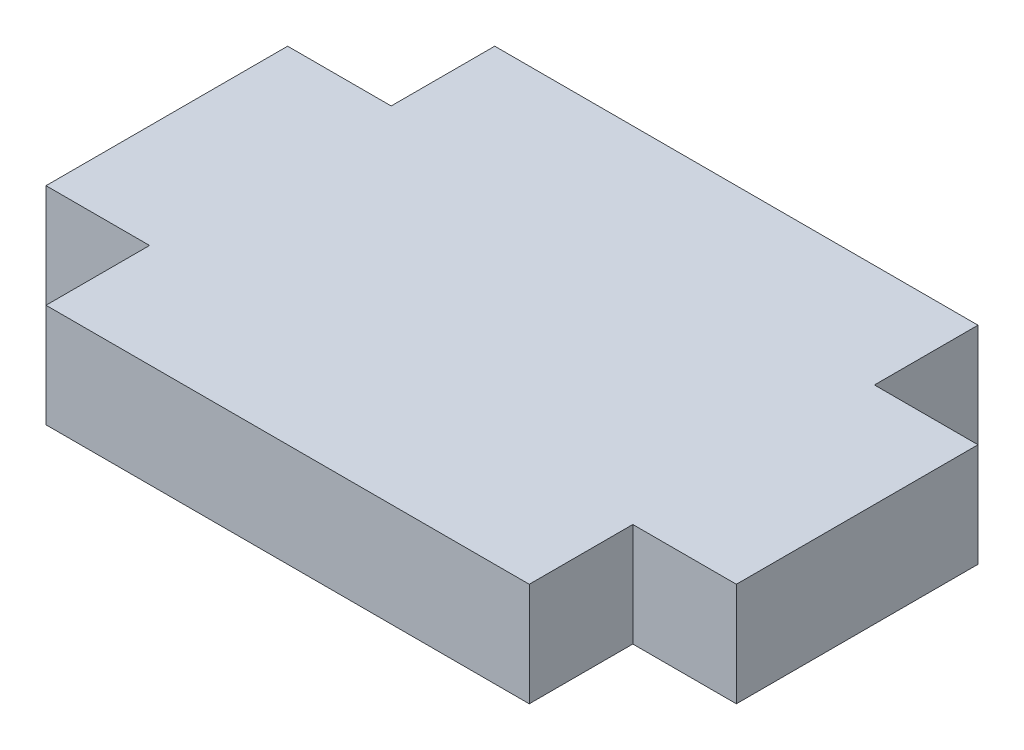
ISO-10303-21;
HEADER;
FILE_DESCRIPTION(('STEP AP214'),'2;1');
FILE_NAME('part.step','',(''),(''),'','','');
FILE_SCHEMA(('AUTOMOTIVE_DESIGN { 1 0 10303 214 1 1 1 1 }'));
ENDSEC;
DATA;
#1=APPLICATION_CONTEXT('core data for automotive mechanical design processes');
#2=APPLICATION_PROTOCOL_DEFINITION('international standard','automotive_design',2000,#1);
#3=PRODUCT_CONTEXT('',#1,'mechanical');
#4=PRODUCT('Part','Part','',(#3));
#5=PRODUCT_RELATED_PRODUCT_CATEGORY('part','',(#4));
#6=PRODUCT_DEFINITION_FORMATION('','',#4);
#7=PRODUCT_DEFINITION_CONTEXT('part definition',#1,'design');
#8=PRODUCT_DEFINITION('design','',#6,#7);
#9=PRODUCT_DEFINITION_SHAPE('','',#8);
#10=(LENGTH_UNIT() NAMED_UNIT(*) SI_UNIT(.MILLI.,.METRE.));
#11=(NAMED_UNIT(*) PLANE_ANGLE_UNIT() SI_UNIT($,.RADIAN.));
#12=(NAMED_UNIT(*) SI_UNIT($,.STERADIAN.) SOLID_ANGLE_UNIT());
#13=UNCERTAINTY_MEASURE_WITH_UNIT(LENGTH_MEASURE(1.E-05),#10,'distance_accuracy_value','');
#14=(GEOMETRIC_REPRESENTATION_CONTEXT(3) GLOBAL_UNCERTAINTY_ASSIGNED_CONTEXT((#13)) GLOBAL_UNIT_ASSIGNED_CONTEXT((#10,
#11,#12)) REPRESENTATION_CONTEXT('',''));
#15=CARTESIAN_POINT('',(0.,0.,0.));
#16=DIRECTION('',(0.,0.,1.));
#17=DIRECTION('',(1.,0.,0.));
#18=AXIS2_PLACEMENT_3D('',#15,#16,#17);
#19=CARTESIAN_POINT('',(3.,3.,0.));
#20=DIRECTION('',(0.,0.,-1.));
#21=DIRECTION('',(-1.,0.,0.));
#22=AXIS2_PLACEMENT_3D('',#19,#20,#21);
#23=PLANE('',#22);
#24=DIRECTION('',(1.,0.,0.));
#25=VECTOR('',#24,1.);
#26=CARTESIAN_POINT('',(3.,0.,0.));
#27=LINE('',#26,#25);
#28=CARTESIAN_POINT('',(0.,0.,0.));
#29=VERTEX_POINT('',#28);
#30=CARTESIAN_POINT('',(3.,0.,0.));
#31=VERTEX_POINT('',#30);
#32=EDGE_CURVE('E153',#29,#31,#27,.T.);
#33=ORIENTED_EDGE('',*,*,#32,.T.);
#34=DIRECTION('',(0.,-1.,0.));
#35=VECTOR('',#34,1.);
#36=CARTESIAN_POINT('',(3.,3.,0.));
#37=LINE('',#36,#35);
#38=CARTESIAN_POINT('',(3.,3.,0.));
#39=VERTEX_POINT('',#38);
#40=EDGE_CURVE('E11',#39,#31,#37,.T.);
#41=ORIENTED_EDGE('',*,*,#40,.F.);
#42=DIRECTION('',(1.,0.,0.));
#43=VECTOR('',#42,1.);
#44=CARTESIAN_POINT('',(3.,3.,0.));
#45=LINE('',#44,#43);
#46=CARTESIAN_POINT('',(0.,3.,0.));
#47=VERTEX_POINT('',#46);
#48=EDGE_CURVE('E175',#47,#39,#45,.T.);
#49=ORIENTED_EDGE('',*,*,#48,.F.);
#50=DIRECTION('',(0.,-1.,0.));
#51=VECTOR('',#50,1.);
#52=CARTESIAN_POINT('',(0.,3.,0.));
#53=LINE('',#52,#51);
#54=EDGE_CURVE('E149',#47,#29,#53,.T.);
#55=ORIENTED_EDGE('',*,*,#54,.T.);
#56=EDGE_LOOP('',(#33,#41,#49,#55));
#57=FACE_BOUND('',#56,.T.);
#58=ADVANCED_FACE('F33',(#57),#23,.F.);
#59=CARTESIAN_POINT('',(3.,3.,3.));
#60=DIRECTION('',(1.,0.,0.));
#61=DIRECTION('',(0.,0.,-1.));
#62=AXIS2_PLACEMENT_3D('',#59,#60,#61);
#63=PLANE('',#62);
#64=DIRECTION('',(0.,0.,1.));
#65=VECTOR('',#64,1.);
#66=CARTESIAN_POINT('',(3.,0.,3.));
#67=LINE('',#66,#65);
#68=CARTESIAN_POINT('',(3.,0.,3.));
#69=VERTEX_POINT('',#68);
#70=EDGE_CURVE('E156',#31,#69,#67,.T.);
#71=ORIENTED_EDGE('',*,*,#70,.T.);
#72=DIRECTION('',(0.,-1.,0.));
#73=VECTOR('',#72,1.);
#74=CARTESIAN_POINT('',(3.,3.,3.));
#75=LINE('',#74,#73);
#76=CARTESIAN_POINT('',(3.,3.,3.));
#77=VERTEX_POINT('',#76);
#78=EDGE_CURVE('E41',#77,#69,#75,.T.);
#79=ORIENTED_EDGE('',*,*,#78,.F.);
#80=DIRECTION('',(0.,0.,1.));
#81=VECTOR('',#80,1.);
#82=CARTESIAN_POINT('',(3.,3.,3.));
#83=LINE('',#82,#81);
#84=EDGE_CURVE('E104',#39,#77,#83,.T.);
#85=ORIENTED_EDGE('',*,*,#84,.F.);
#86=ORIENTED_EDGE('',*,*,#40,.T.);
#87=EDGE_LOOP('',(#71,#79,#85,#86));
#88=FACE_BOUND('',#87,.T.);
#89=ADVANCED_FACE('F253',(#88),#63,.F.);
#90=CARTESIAN_POINT('',(3.,3.,3.));
#91=DIRECTION('',(0.,0.,-1.));
#92=DIRECTION('',(-1.,0.,0.));
#93=AXIS2_PLACEMENT_3D('',#90,#91,#92);
#94=PLANE('',#93);
#95=DIRECTION('',(1.,0.,0.));
#96=VECTOR('',#95,1.);
#97=CARTESIAN_POINT('',(3.,0.,3.));
#98=LINE('',#97,#96);
#99=CARTESIAN_POINT('',(17.,0.,3.));
#100=VERTEX_POINT('',#99);
#101=EDGE_CURVE('E158',#69,#100,#98,.T.);
#102=ORIENTED_EDGE('',*,*,#101,.T.);
#103=DIRECTION('',(0.,-1.,0.));
#104=VECTOR('',#103,1.);
#105=CARTESIAN_POINT('',(17.,3.,3.));
#106=LINE('',#105,#104);
#107=CARTESIAN_POINT('',(17.,3.,3.));
#108=VERTEX_POINT('',#107);
#109=EDGE_CURVE('E194',#108,#100,#106,.T.);
#110=ORIENTED_EDGE('',*,*,#109,.F.);
#111=DIRECTION('',(1.,0.,0.));
#112=VECTOR('',#111,1.);
#113=CARTESIAN_POINT('',(3.,3.,3.));
#114=LINE('',#113,#112);
#115=EDGE_CURVE('E202',#77,#108,#114,.T.);
#116=ORIENTED_EDGE('',*,*,#115,.F.);
#117=ORIENTED_EDGE('',*,*,#78,.T.);
#118=EDGE_LOOP('',(#102,#110,#116,#117));
#119=FACE_BOUND('',#118,.T.);
#120=ADVANCED_FACE('F200',(#119),#94,.F.);
#121=CARTESIAN_POINT('',(17.,3.,3.));
#122=DIRECTION('',(-1.,0.,0.));
#123=DIRECTION('',(0.,0.,1.));
#124=AXIS2_PLACEMENT_3D('',#121,#122,#123);
#125=PLANE('',#124);
#126=DIRECTION('',(0.,0.,-1.));
#127=VECTOR('',#126,1.);
#128=CARTESIAN_POINT('',(17.,0.,3.));
#129=LINE('',#128,#127);
#130=CARTESIAN_POINT('',(17.,0.,0.));
#131=VERTEX_POINT('',#130);
#132=EDGE_CURVE('E160',#100,#131,#129,.T.);
#133=ORIENTED_EDGE('',*,*,#132,.T.);
#134=DIRECTION('',(0.,-1.,0.));
#135=VECTOR('',#134,1.);
#136=CARTESIAN_POINT('',(17.,3.,0.));
#137=LINE('',#136,#135);
#138=CARTESIAN_POINT('',(17.,3.,0.));
#139=VERTEX_POINT('',#138);
#140=EDGE_CURVE('E191',#139,#131,#137,.T.);
#141=ORIENTED_EDGE('',*,*,#140,.F.);
#142=DIRECTION('',(0.,0.,-1.));
#143=VECTOR('',#142,1.);
#144=CARTESIAN_POINT('',(17.,3.,3.));
#145=LINE('',#144,#143);
#146=EDGE_CURVE('E220',#108,#139,#145,.T.);
#147=ORIENTED_EDGE('',*,*,#146,.F.);
#148=ORIENTED_EDGE('',*,*,#109,.T.);
#149=EDGE_LOOP('',(#133,#141,#147,#148));
#150=FACE_BOUND('',#149,.T.);
#151=ADVANCED_FACE('F211',(#150),#125,.F.);
#152=CARTESIAN_POINT('',(20.,3.,0.));
#153=DIRECTION('',(0.,0.,-1.));
#154=DIRECTION('',(-1.,0.,0.));
#155=AXIS2_PLACEMENT_3D('',#152,#153,#154);
#156=PLANE('',#155);
#157=DIRECTION('',(1.,0.,0.));
#158=VECTOR('',#157,1.);
#159=CARTESIAN_POINT('',(20.,0.,0.));
#160=LINE('',#159,#158);
#161=CARTESIAN_POINT('',(20.,0.,0.));
#162=VERTEX_POINT('',#161);
#163=EDGE_CURVE('E162',#131,#162,#160,.T.);
#164=ORIENTED_EDGE('',*,*,#163,.T.);
#165=DIRECTION('',(0.,-1.,0.));
#166=VECTOR('',#165,1.);
#167=CARTESIAN_POINT('',(20.,3.,0.));
#168=LINE('',#167,#166);
#169=CARTESIAN_POINT('',(20.,3.,0.));
#170=VERTEX_POINT('',#169);
#171=EDGE_CURVE('E188',#170,#162,#168,.T.);
#172=ORIENTED_EDGE('',*,*,#171,.F.);
#173=DIRECTION('',(1.,0.,0.));
#174=VECTOR('',#173,1.);
#175=CARTESIAN_POINT('',(20.,3.,0.));
#176=LINE('',#175,#174);
#177=EDGE_CURVE('E217',#139,#170,#176,.T.);
#178=ORIENTED_EDGE('',*,*,#177,.F.);
#179=ORIENTED_EDGE('',*,*,#140,.T.);
#180=EDGE_LOOP('',(#164,#172,#178,#179));
#181=FACE_BOUND('',#180,.T.);
#182=ADVANCED_FACE('F215',(#181),#156,.F.);
#183=CARTESIAN_POINT('',(20.,3.,-7.));
#184=DIRECTION('',(-1.,0.,0.));
#185=DIRECTION('',(0.,0.,1.));
#186=AXIS2_PLACEMENT_3D('',#183,#184,#185);
#187=PLANE('',#186);
#188=DIRECTION('',(0.,0.,-1.));
#189=VECTOR('',#188,1.);
#190=CARTESIAN_POINT('',(20.,0.,-7.));
#191=LINE('',#190,#189);
#192=CARTESIAN_POINT('',(20.,0.,-7.));
#193=VERTEX_POINT('',#192);
#194=EDGE_CURVE('E164',#162,#193,#191,.T.);
#195=ORIENTED_EDGE('',*,*,#194,.T.);
#196=DIRECTION('',(0.,-1.,0.));
#197=VECTOR('',#196,1.);
#198=CARTESIAN_POINT('',(20.,3.,-7.));
#199=LINE('',#198,#197);
#200=CARTESIAN_POINT('',(20.,3.,-7.));
#201=VERTEX_POINT('',#200);
#202=EDGE_CURVE('E185',#201,#193,#199,.T.);
#203=ORIENTED_EDGE('',*,*,#202,.F.);
#204=DIRECTION('',(0.,0.,-1.));
#205=VECTOR('',#204,1.);
#206=CARTESIAN_POINT('',(20.,3.,-7.));
#207=LINE('',#206,#205);
#208=EDGE_CURVE('E219',#170,#201,#207,.T.);
#209=ORIENTED_EDGE('',*,*,#208,.F.);
#210=ORIENTED_EDGE('',*,*,#171,.T.);
#211=EDGE_LOOP('',(#195,#203,#209,#210));
#212=FACE_BOUND('',#211,.T.);
#213=ADVANCED_FACE('F266',(#212),#187,.F.);
#214=CARTESIAN_POINT('',(17.,3.,-7.));
#215=DIRECTION('',(0.,0.,1.));
#216=DIRECTION('',(1.,0.,0.));
#217=AXIS2_PLACEMENT_3D('',#214,#215,#216);
#218=PLANE('',#217);
#219=DIRECTION('',(-1.,0.,0.));
#220=VECTOR('',#219,1.);
#221=CARTESIAN_POINT('',(17.,0.,-7.));
#222=LINE('',#221,#220);
#223=CARTESIAN_POINT('',(17.,0.,-7.));
#224=VERTEX_POINT('',#223);
#225=EDGE_CURVE('E166',#193,#224,#222,.T.);
#226=ORIENTED_EDGE('',*,*,#225,.T.);
#227=DIRECTION('',(0.,-1.,0.));
#228=VECTOR('',#227,1.);
#229=CARTESIAN_POINT('',(17.,3.,-7.));
#230=LINE('',#229,#228);
#231=CARTESIAN_POINT('',(17.,3.,-7.));
#232=VERTEX_POINT('',#231);
#233=EDGE_CURVE('E182',#232,#224,#230,.T.);
#234=ORIENTED_EDGE('',*,*,#233,.F.);
#235=DIRECTION('',(-1.,0.,0.));
#236=VECTOR('',#235,1.);
#237=CARTESIAN_POINT('',(17.,3.,-7.));
#238=LINE('',#237,#236);
#239=EDGE_CURVE('E222',#201,#232,#238,.T.);
#240=ORIENTED_EDGE('',*,*,#239,.F.);
#241=ORIENTED_EDGE('',*,*,#202,.T.);
#242=EDGE_LOOP('',(#226,#234,#240,#241));
#243=FACE_BOUND('',#242,.T.);
#244=ADVANCED_FACE('F269',(#243),#218,.F.);
#245=CARTESIAN_POINT('',(17.,3.,-10.));
#246=DIRECTION('',(-1.,0.,0.));
#247=DIRECTION('',(0.,0.,1.));
#248=AXIS2_PLACEMENT_3D('',#245,#246,#247);
#249=PLANE('',#248);
#250=DIRECTION('',(0.,0.,-1.));
#251=VECTOR('',#250,1.);
#252=CARTESIAN_POINT('',(17.,0.,-10.));
#253=LINE('',#252,#251);
#254=CARTESIAN_POINT('',(17.,0.,-10.));
#255=VERTEX_POINT('',#254);
#256=EDGE_CURVE('E168',#224,#255,#253,.T.);
#257=ORIENTED_EDGE('',*,*,#256,.T.);
#258=DIRECTION('',(0.,-1.,0.));
#259=VECTOR('',#258,1.);
#260=CARTESIAN_POINT('',(17.,3.,-10.));
#261=LINE('',#260,#259);
#262=CARTESIAN_POINT('',(17.,3.,-10.));
#263=VERTEX_POINT('',#262);
#264=EDGE_CURVE('E179',#263,#255,#261,.T.);
#265=ORIENTED_EDGE('',*,*,#264,.F.);
#266=DIRECTION('',(0.,0.,-1.));
#267=VECTOR('',#266,1.);
#268=CARTESIAN_POINT('',(17.,3.,-10.));
#269=LINE('',#268,#267);
#270=EDGE_CURVE('E228',#232,#263,#269,.T.);
#271=ORIENTED_EDGE('',*,*,#270,.F.);
#272=ORIENTED_EDGE('',*,*,#233,.T.);
#273=EDGE_LOOP('',(#257,#265,#271,#272));
#274=FACE_BOUND('',#273,.T.);
#275=ADVANCED_FACE('F234',(#274),#249,.F.);
#276=CARTESIAN_POINT('',(3.,3.,-10.));
#277=DIRECTION('',(0.,0.,1.));
#278=DIRECTION('',(1.,0.,0.));
#279=AXIS2_PLACEMENT_3D('',#276,#277,#278);
#280=PLANE('',#279);
#281=DIRECTION('',(-1.,0.,0.));
#282=VECTOR('',#281,1.);
#283=CARTESIAN_POINT('',(3.,0.,-10.));
#284=LINE('',#283,#282);
#285=CARTESIAN_POINT('',(3.,0.,-10.));
#286=VERTEX_POINT('',#285);
#287=EDGE_CURVE('E170',#255,#286,#284,.T.);
#288=ORIENTED_EDGE('',*,*,#287,.T.);
#289=DIRECTION('',(0.,-1.,0.));
#290=VECTOR('',#289,1.);
#291=CARTESIAN_POINT('',(3.,3.,-10.));
#292=LINE('',#291,#290);
#293=CARTESIAN_POINT('',(3.,3.,-10.));
#294=VERTEX_POINT('',#293);
#295=EDGE_CURVE('E144',#294,#286,#292,.T.);
#296=ORIENTED_EDGE('',*,*,#295,.F.);
#297=DIRECTION('',(-1.,0.,0.));
#298=VECTOR('',#297,1.);
#299=CARTESIAN_POINT('',(3.,3.,-10.));
#300=LINE('',#299,#298);
#301=EDGE_CURVE('E135',#263,#294,#300,.T.);
#302=ORIENTED_EDGE('',*,*,#301,.F.);
#303=ORIENTED_EDGE('',*,*,#264,.T.);
#304=EDGE_LOOP('',(#288,#296,#302,#303));
#305=FACE_BOUND('',#304,.T.);
#306=ADVANCED_FACE('F238',(#305),#280,.F.);
#307=CARTESIAN_POINT('',(3.,3.,-10.));
#308=DIRECTION('',(1.,0.,0.));
#309=DIRECTION('',(0.,0.,-1.));
#310=AXIS2_PLACEMENT_3D('',#307,#308,#309);
#311=PLANE('',#310);
#312=DIRECTION('',(0.,0.,1.));
#313=VECTOR('',#312,1.);
#314=CARTESIAN_POINT('',(3.,0.,-10.));
#315=LINE('',#314,#313);
#316=CARTESIAN_POINT('',(3.,0.,-7.));
#317=VERTEX_POINT('',#316);
#318=EDGE_CURVE('E143',#286,#317,#315,.T.);
#319=ORIENTED_EDGE('',*,*,#318,.T.);
#320=DIRECTION('',(0.,-1.,0.));
#321=VECTOR('',#320,1.);
#322=CARTESIAN_POINT('',(3.,3.,-7.));
#323=LINE('',#322,#321);
#324=CARTESIAN_POINT('',(3.,3.,-7.));
#325=VERTEX_POINT('',#324);
#326=EDGE_CURVE('E140',#325,#317,#323,.T.);
#327=ORIENTED_EDGE('',*,*,#326,.F.);
#328=DIRECTION('',(0.,0.,1.));
#329=VECTOR('',#328,1.);
#330=CARTESIAN_POINT('',(3.,3.,-10.));
#331=LINE('',#330,#329);
#332=EDGE_CURVE('E129',#294,#325,#331,.T.);
#333=ORIENTED_EDGE('',*,*,#332,.F.);
#334=ORIENTED_EDGE('',*,*,#295,.T.);
#335=EDGE_LOOP('',(#319,#327,#333,#334));
#336=FACE_BOUND('',#335,.T.);
#337=ADVANCED_FACE('F141',(#336),#311,.F.);
#338=CARTESIAN_POINT('',(0.,3.,-7.));
#339=DIRECTION('',(0.,0.,1.));
#340=DIRECTION('',(1.,0.,0.));
#341=AXIS2_PLACEMENT_3D('',#338,#339,#340);
#342=PLANE('',#341);
#343=DIRECTION('',(-1.,0.,0.));
#344=VECTOR('',#343,1.);
#345=CARTESIAN_POINT('',(0.,0.,-7.));
#346=LINE('',#345,#344);
#347=CARTESIAN_POINT('',(0.,0.,-7.));
#348=VERTEX_POINT('',#347);
#349=EDGE_CURVE('E90',#317,#348,#346,.T.);
#350=ORIENTED_EDGE('',*,*,#349,.T.);
#351=DIRECTION('',(0.,-1.,0.));
#352=VECTOR('',#351,1.);
#353=CARTESIAN_POINT('',(0.,3.,-7.));
#354=LINE('',#353,#352);
#355=CARTESIAN_POINT('',(0.,3.,-7.));
#356=VERTEX_POINT('',#355);
#357=EDGE_CURVE('E145',#356,#348,#354,.T.);
#358=ORIENTED_EDGE('',*,*,#357,.F.);
#359=DIRECTION('',(-1.,0.,0.));
#360=VECTOR('',#359,1.);
#361=CARTESIAN_POINT('',(0.,3.,-7.));
#362=LINE('',#361,#360);
#363=EDGE_CURVE('E133',#325,#356,#362,.T.);
#364=ORIENTED_EDGE('',*,*,#363,.F.);
#365=ORIENTED_EDGE('',*,*,#326,.T.);
#366=EDGE_LOOP('',(#350,#358,#364,#365));
#367=FACE_BOUND('',#366,.T.);
#368=ADVANCED_FACE('F147',(#367),#342,.F.);
#369=CARTESIAN_POINT('',(0.,3.,0.));
#370=DIRECTION('',(1.,0.,0.));
#371=DIRECTION('',(0.,0.,-1.));
#372=AXIS2_PLACEMENT_3D('',#369,#370,#371);
#373=PLANE('',#372);
#374=DIRECTION('',(0.,0.,1.));
#375=VECTOR('',#374,1.);
#376=CARTESIAN_POINT('',(0.,0.,0.));
#377=LINE('',#376,#375);
#378=EDGE_CURVE('E96',#348,#29,#377,.T.);
#379=ORIENTED_EDGE('',*,*,#378,.T.);
#380=ORIENTED_EDGE('',*,*,#54,.F.);
#381=DIRECTION('',(0.,0.,1.));
#382=VECTOR('',#381,1.);
#383=CARTESIAN_POINT('',(0.,3.,0.));
#384=LINE('',#383,#382);
#385=EDGE_CURVE('E49',#356,#47,#384,.T.);
#386=ORIENTED_EDGE('',*,*,#385,.F.);
#387=ORIENTED_EDGE('',*,*,#357,.T.);
#388=EDGE_LOOP('',(#379,#380,#386,#387));
#389=FACE_BOUND('',#388,.T.);
#390=ADVANCED_FACE('F242',(#389),#373,.F.);
#391=CARTESIAN_POINT('',(0.,3.,0.));
#392=DIRECTION('',(0.,-1.,0.));
#393=DIRECTION('',(0.,0.,-1.));
#394=AXIS2_PLACEMENT_3D('',#391,#392,#393);
#395=PLANE('',#394);
#396=ORIENTED_EDGE('',*,*,#48,.T.);
#397=ORIENTED_EDGE('',*,*,#84,.T.);
#398=ORIENTED_EDGE('',*,*,#115,.T.);
#399=ORIENTED_EDGE('',*,*,#146,.T.);
#400=ORIENTED_EDGE('',*,*,#177,.T.);
#401=ORIENTED_EDGE('',*,*,#208,.T.);
#402=ORIENTED_EDGE('',*,*,#239,.T.);
#403=ORIENTED_EDGE('',*,*,#270,.T.);
#404=ORIENTED_EDGE('',*,*,#301,.T.);
#405=ORIENTED_EDGE('',*,*,#332,.T.);
#406=ORIENTED_EDGE('',*,*,#363,.T.);
#407=ORIENTED_EDGE('',*,*,#385,.T.);
#408=EDGE_LOOP('',(#396,#397,#398,#399,#400,#401,#402,#403,#404,#405,#406,#407));
#409=FACE_BOUND('',#408,.T.);
#410=ADVANCED_FACE('F131',(#409),#395,.F.);
#411=CARTESIAN_POINT('',(0.,0.,0.));
#412=DIRECTION('',(0.,-1.,0.));
#413=DIRECTION('',(0.,0.,-1.));
#414=AXIS2_PLACEMENT_3D('',#411,#412,#413);
#415=PLANE('',#414);
#416=ORIENTED_EDGE('',*,*,#32,.F.);
#417=ORIENTED_EDGE('',*,*,#378,.F.);
#418=ORIENTED_EDGE('',*,*,#349,.F.);
#419=ORIENTED_EDGE('',*,*,#318,.F.);
#420=ORIENTED_EDGE('',*,*,#287,.F.);
#421=ORIENTED_EDGE('',*,*,#256,.F.);
#422=ORIENTED_EDGE('',*,*,#225,.F.);
#423=ORIENTED_EDGE('',*,*,#194,.F.);
#424=ORIENTED_EDGE('',*,*,#163,.F.);
#425=ORIENTED_EDGE('',*,*,#132,.F.);
#426=ORIENTED_EDGE('',*,*,#101,.F.);
#427=ORIENTED_EDGE('',*,*,#70,.F.);
#428=EDGE_LOOP('',(#416,#417,#418,#419,#420,#421,#422,#423,#424,#425,#426,#427));
#429=FACE_BOUND('',#428,.T.);
#430=ADVANCED_FACE('F206',(#429),#415,.T.);
#431=CLOSED_SHELL('',(#58,#89,#120,#151,#182,#213,#244,#275,#306,#337,#368,#390,#410,#430));
#432=MANIFOLD_SOLID_BREP('B2',#431);
#433=ADVANCED_BREP_SHAPE_REPRESENTATION('',(#18,#432),#14);
#434=SHAPE_DEFINITION_REPRESENTATION(#9,#433);
ENDSEC;
END-ISO-10303-21;
